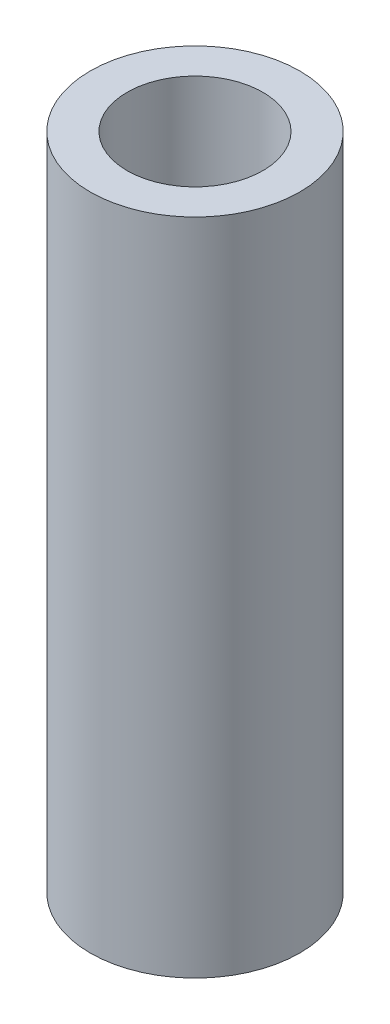
ISO-10303-21;
HEADER;
FILE_DESCRIPTION(('STEP AP214'),'2;1');
FILE_NAME('part.step','',(''),(''),'','','');
FILE_SCHEMA(('AUTOMOTIVE_DESIGN { 1 0 10303 214 1 1 1 1 }'));
ENDSEC;
DATA;
#1=APPLICATION_CONTEXT('core data for automotive mechanical design processes');
#2=APPLICATION_PROTOCOL_DEFINITION('international standard','automotive_design',2000,#1);
#3=PRODUCT_CONTEXT('',#1,'mechanical');
#4=PRODUCT('Part','Part','',(#3));
#5=PRODUCT_RELATED_PRODUCT_CATEGORY('part','',(#4));
#6=PRODUCT_DEFINITION_FORMATION('','',#4);
#7=PRODUCT_DEFINITION_CONTEXT('part definition',#1,'design');
#8=PRODUCT_DEFINITION('design','',#6,#7);
#9=PRODUCT_DEFINITION_SHAPE('','',#8);
#10=(LENGTH_UNIT() NAMED_UNIT(*) SI_UNIT(.MILLI.,.METRE.));
#11=(NAMED_UNIT(*) PLANE_ANGLE_UNIT() SI_UNIT($,.RADIAN.));
#12=(NAMED_UNIT(*) SI_UNIT($,.STERADIAN.) SOLID_ANGLE_UNIT());
#13=UNCERTAINTY_MEASURE_WITH_UNIT(LENGTH_MEASURE(1.E-05),#10,'distance_accuracy_value','');
#14=(GEOMETRIC_REPRESENTATION_CONTEXT(3) GLOBAL_UNCERTAINTY_ASSIGNED_CONTEXT((#13)) GLOBAL_UNIT_ASSIGNED_CONTEXT((#10,
#11,#12)) REPRESENTATION_CONTEXT('',''));
#15=CARTESIAN_POINT('',(0.,0.,0.));
#16=DIRECTION('',(0.,0.,1.));
#17=DIRECTION('',(1.,0.,0.));
#18=AXIS2_PLACEMENT_3D('',#15,#16,#17);
#19=CARTESIAN_POINT('',(0.,9.9822,0.));
#20=DIRECTION('',(0.,-1.,0.));
#21=DIRECTION('',(0.,0.,-1.));
#22=AXIS2_PLACEMENT_3D('',#19,#20,#21);
#23=CYLINDRICAL_SURFACE('',#22,1.5875);
#24=CARTESIAN_POINT('',(0.,9.9822,0.));
#25=DIRECTION('',(0.,1.,0.));
#26=DIRECTION('',(0.,0.,1.));
#27=AXIS2_PLACEMENT_3D('',#24,#25,#26);
#28=CIRCLE('',#27,1.5875);
#29=CARTESIAN_POINT('',(0.,9.9822,-1.5875));
#30=VERTEX_POINT('',#29);
#31=EDGE_CURVE('E10',#30,#30,#28,.T.);
#32=CARTESIAN_POINT('',(0.,0.,0.));
#33=DIRECTION('',(0.,1.,0.));
#34=DIRECTION('',(0.,0.,1.));
#35=AXIS2_PLACEMENT_3D('',#32,#33,#34);
#36=CIRCLE('',#35,1.5875);
#37=CARTESIAN_POINT('',(0.,0.,-1.5875));
#38=VERTEX_POINT('',#37);
#39=EDGE_CURVE('E34',#38,#38,#36,.T.);
#40=CARTESIAN_POINT('',(0.,9.9822,-1.5875));
#41=CARTESIAN_POINT('',(0.,9.87821875,-1.5875));
#42=CARTESIAN_POINT('',(0.,9.7742375,-1.5875));
#43=CARTESIAN_POINT('',(0.,9.566275,-1.5875));
#44=CARTESIAN_POINT('',(0.,9.46229375,-1.5875));
#45=CARTESIAN_POINT('',(0.,9.25433125,-1.5875));
#46=CARTESIAN_POINT('',(0.,9.15035,-1.5875));
#47=CARTESIAN_POINT('',(0.,8.9423875,-1.5875));
#48=CARTESIAN_POINT('',(0.,8.83840625,-1.5875));
#49=CARTESIAN_POINT('',(0.,8.63044375,-1.5875));
#50=CARTESIAN_POINT('',(0.,8.5264625,-1.5875));
#51=CARTESIAN_POINT('',(0.,8.3185,-1.5875));
#52=CARTESIAN_POINT('',(0.,8.21451875,-1.5875));
#53=CARTESIAN_POINT('',(0.,8.00655625,-1.5875));
#54=CARTESIAN_POINT('',(0.,7.902575,-1.5875));
#55=CARTESIAN_POINT('',(0.,7.6946125,-1.5875));
#56=CARTESIAN_POINT('',(0.,7.59063125,-1.5875));
#57=CARTESIAN_POINT('',(0.,7.38266875,-1.5875));
#58=CARTESIAN_POINT('',(0.,7.2786875,-1.5875));
#59=CARTESIAN_POINT('',(0.,7.070725,-1.5875));
#60=CARTESIAN_POINT('',(0.,6.96674375,-1.5875));
#61=CARTESIAN_POINT('',(0.,6.75878125,-1.5875));
#62=CARTESIAN_POINT('',(0.,6.6548,-1.5875));
#63=CARTESIAN_POINT('',(0.,6.4468375,-1.5875));
#64=CARTESIAN_POINT('',(0.,6.34285625,-1.5875));
#65=CARTESIAN_POINT('',(0.,6.13489375,-1.5875));
#66=CARTESIAN_POINT('',(0.,6.0309125,-1.5875));
#67=CARTESIAN_POINT('',(0.,5.82295,-1.5875));
#68=CARTESIAN_POINT('',(0.,5.71896875,-1.5875));
#69=CARTESIAN_POINT('',(0.,5.51100625,-1.5875));
#70=CARTESIAN_POINT('',(0.,5.407025,-1.5875));
#71=CARTESIAN_POINT('',(0.,5.1990625,-1.5875));
#72=CARTESIAN_POINT('',(0.,5.09508125,-1.5875));
#73=CARTESIAN_POINT('',(0.,4.88711875,-1.5875));
#74=CARTESIAN_POINT('',(0.,4.7831375,-1.5875));
#75=CARTESIAN_POINT('',(0.,4.575175,-1.5875));
#76=CARTESIAN_POINT('',(0.,4.47119375,-1.5875));
#77=CARTESIAN_POINT('',(0.,4.26323125,-1.5875));
#78=CARTESIAN_POINT('',(0.,4.15925,-1.5875));
#79=CARTESIAN_POINT('',(0.,3.9512875,-1.5875));
#80=CARTESIAN_POINT('',(0.,3.84730625,-1.5875));
#81=CARTESIAN_POINT('',(0.,3.63934375,-1.5875));
#82=CARTESIAN_POINT('',(0.,3.5353625,-1.5875));
#83=CARTESIAN_POINT('',(0.,3.3274,-1.5875));
#84=CARTESIAN_POINT('',(0.,3.22341875,-1.5875));
#85=CARTESIAN_POINT('',(0.,3.01545625,-1.5875));
#86=CARTESIAN_POINT('',(0.,2.911475,-1.5875));
#87=CARTESIAN_POINT('',(0.,2.7035125,-1.5875));
#88=CARTESIAN_POINT('',(0.,2.59953125,-1.5875));
#89=CARTESIAN_POINT('',(0.,2.39156875,-1.5875));
#90=CARTESIAN_POINT('',(0.,2.2875875,-1.5875));
#91=CARTESIAN_POINT('',(0.,2.079625,-1.5875));
#92=CARTESIAN_POINT('',(0.,1.97564375,-1.5875));
#93=CARTESIAN_POINT('',(0.,1.76768125,-1.5875));
#94=CARTESIAN_POINT('',(0.,1.6637,-1.5875));
#95=CARTESIAN_POINT('',(0.,1.4557375,-1.5875));
#96=CARTESIAN_POINT('',(0.,1.35175625,-1.5875));
#97=CARTESIAN_POINT('',(0.,1.14379375,-1.5875));
#98=CARTESIAN_POINT('',(0.,1.0398125,-1.5875));
#99=CARTESIAN_POINT('',(0.,0.831849999999998,-1.5875));
#100=CARTESIAN_POINT('',(0.,0.727868749999998,-1.5875));
#101=CARTESIAN_POINT('',(0.,0.519906249999998,-1.5875));
#102=CARTESIAN_POINT('',(0.,0.415924999999998,-1.5875));
#103=CARTESIAN_POINT('',(0.,0.207962499999998,-1.5875));
#104=CARTESIAN_POINT('',(0.,0.103981249999998,-1.5875));
#105=CARTESIAN_POINT('',(0.,0.,-1.5875));
#106=B_SPLINE_CURVE_WITH_KNOTS('',3,(#40,#41,#42,#43,#44,#45,#46,#47,#48,#49,#50,#51,#52,#53,
#54,#55,#56,#57,#58,#59,#60,#61,#62,#63,#64,#65,#66,#67,#68,#69,#70,#71,#72,#73,#74,#75,#76,#77,
#78,#79,#80,#81,#82,#83,#84,#85,#86,#87,#88,#89,#90,#91,#92,#93,#94,#95,#96,#97,#98,#99,#100,
#101,#102,#103,#104,#105),.UNSPECIFIED.,.F.,.F.,(4,2,2,2,2,2,2,2,2,2,2,2,2,2,2,2,2,2,2,2,2,2,2,
2,2,2,2,2,2,2,2,2,4),(0.,0.311943750000002,0.623887500000001,0.935831250000001,1.247775,
1.55971875,1.8716625,2.18360625,2.49555,2.80749375,3.1194375,3.43138125,3.743325,4.05526875,
4.3672125,4.67915625,4.9911,5.30304375,5.6149875,5.92693125,6.238875,6.55081875,6.8627625,
7.17470625,7.48665,7.79859375,8.1105375,8.42248125,8.734425,9.04636875,9.3583125,9.67025625,
9.9822),.UNSPECIFIED.);
#107=EDGE_CURVE('BSEAM31',#30,#38,#106,.T.);
#108=ORIENTED_EDGE('',*,*,#31,.F.);
#109=ORIENTED_EDGE('',*,*,#39,.T.);
#110=ORIENTED_EDGE('',*,*,#107,.T.);
#111=ORIENTED_EDGE('',*,*,#107,.F.);
#112=EDGE_LOOP('',(#108,#110,#109,#111));
#113=FACE_BOUND('',#112,.T.);
#114=ADVANCED_FACE('F31',(#113),#23,.T.);
#115=CARTESIAN_POINT('',(0.,9.9822,0.));
#116=DIRECTION('',(0.,1.,0.));
#117=DIRECTION('',(0.,0.,1.));
#118=AXIS2_PLACEMENT_3D('',#115,#116,#117);
#119=PLANE('',#118);
#120=CARTESIAN_POINT('',(0.,9.9822,0.));
#121=DIRECTION('',(0.,1.,0.));
#122=DIRECTION('',(0.,0.,1.));
#123=AXIS2_PLACEMENT_3D('',#120,#121,#122);
#124=CIRCLE('',#123,1.02869999999999);
#125=CARTESIAN_POINT('',(0.,9.9822,1.02869999999999));
#126=VERTEX_POINT('',#125);
#127=EDGE_CURVE('E45',#126,#126,#124,.T.);
#128=ORIENTED_EDGE('',*,*,#127,.F.);
#129=EDGE_LOOP('',(#128));
#130=FACE_BOUND('',#129,.T.);
#131=ORIENTED_EDGE('',*,*,#31,.T.);
#132=EDGE_LOOP('',(#131));
#133=FACE_BOUND('',#132,.T.);
#134=ADVANCED_FACE('F51',(#130,#133),#119,.T.);
#135=CARTESIAN_POINT('',(0.,0.,0.));
#136=DIRECTION('',(0.,1.,0.));
#137=DIRECTION('',(0.,0.,1.));
#138=AXIS2_PLACEMENT_3D('',#135,#136,#137);
#139=PLANE('',#138);
#140=CARTESIAN_POINT('',(0.,0.,0.));
#141=DIRECTION('',(0.,1.,0.));
#142=DIRECTION('',(0.,0.,1.));
#143=AXIS2_PLACEMENT_3D('',#140,#141,#142);
#144=CIRCLE('',#143,1.0287);
#145=CARTESIAN_POINT('',(0.,0.,1.0287));
#146=VERTEX_POINT('',#145);
#147=EDGE_CURVE('E41',#146,#146,#144,.T.);
#148=ORIENTED_EDGE('',*,*,#147,.T.);
#149=EDGE_LOOP('',(#148));
#150=FACE_BOUND('',#149,.T.);
#151=ORIENTED_EDGE('',*,*,#39,.F.);
#152=EDGE_LOOP('',(#151));
#153=FACE_BOUND('',#152,.T.);
#154=ADVANCED_FACE('F53',(#150,#153),#139,.F.);
#155=CARTESIAN_POINT('',(0.,9.9822,0.));
#156=DIRECTION('',(0.,1.,0.));
#157=DIRECTION('',(0.,0.,1.));
#158=AXIS2_PLACEMENT_3D('',#155,#156,#157);
#159=CYLINDRICAL_SURFACE('',#158,1.02869999999999);
#160=ORIENTED_EDGE('',*,*,#147,.F.);
#161=EDGE_LOOP('',(#160));
#162=FACE_BOUND('',#161,.T.);
#163=ORIENTED_EDGE('',*,*,#127,.T.);
#164=EDGE_LOOP('',(#163));
#165=FACE_BOUND('',#164,.T.);
#166=ADVANCED_FACE('F49',(#162,#165),#159,.F.);
#167=CLOSED_SHELL('',(#114,#134,#154,#166));
#168=MANIFOLD_SOLID_BREP('B2',#167);
#169=ADVANCED_BREP_SHAPE_REPRESENTATION('',(#18,#168),#14);
#170=SHAPE_DEFINITION_REPRESENTATION(#9,#169);
ENDSEC;
END-ISO-10303-21;
